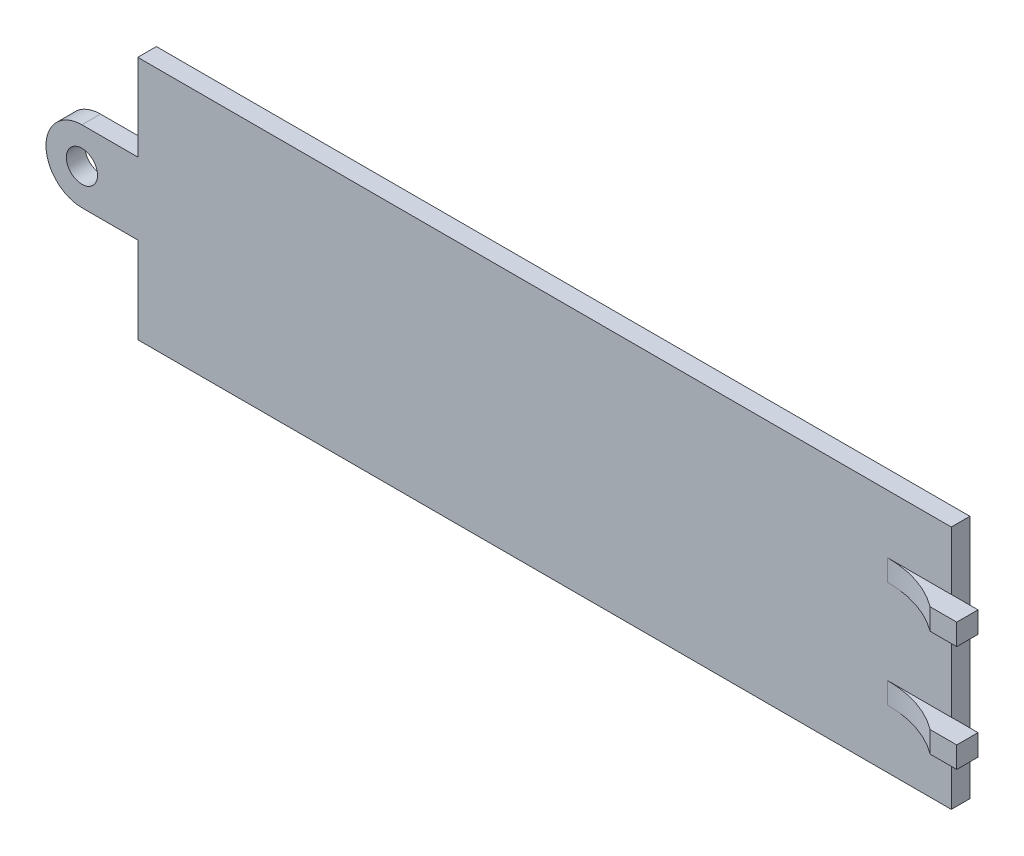
ISO-10303-21;
HEADER;
FILE_DESCRIPTION(('STEP AP214'),'2;1');
FILE_NAME('part.step','',(''),(''),'','','');
FILE_SCHEMA(('AUTOMOTIVE_DESIGN { 1 0 10303 214 1 1 1 1 }'));
ENDSEC;
DATA;
#1=APPLICATION_CONTEXT('core data for automotive mechanical design processes');
#2=APPLICATION_PROTOCOL_DEFINITION('international standard','automotive_design',2000,#1);
#3=PRODUCT_CONTEXT('',#1,'mechanical');
#4=PRODUCT('Part','Part','',(#3));
#5=PRODUCT_RELATED_PRODUCT_CATEGORY('part','',(#4));
#6=PRODUCT_DEFINITION_FORMATION('','',#4);
#7=PRODUCT_DEFINITION_CONTEXT('part definition',#1,'design');
#8=PRODUCT_DEFINITION('design','',#6,#7);
#9=PRODUCT_DEFINITION_SHAPE('','',#8);
#10=(LENGTH_UNIT() NAMED_UNIT(*) SI_UNIT(.MILLI.,.METRE.));
#11=(NAMED_UNIT(*) PLANE_ANGLE_UNIT() SI_UNIT($,.RADIAN.));
#12=(NAMED_UNIT(*) SI_UNIT($,.STERADIAN.) SOLID_ANGLE_UNIT());
#13=UNCERTAINTY_MEASURE_WITH_UNIT(LENGTH_MEASURE(1.E-05),#10,'distance_accuracy_value','');
#14=(GEOMETRIC_REPRESENTATION_CONTEXT(3) GLOBAL_UNCERTAINTY_ASSIGNED_CONTEXT((#13)) GLOBAL_UNIT_ASSIGNED_CONTEXT((#10,
#11,#12)) REPRESENTATION_CONTEXT('',''));
#15=CARTESIAN_POINT('',(0.,0.,0.));
#16=DIRECTION('',(0.,0.,1.));
#17=DIRECTION('',(1.,0.,0.));
#18=AXIS2_PLACEMENT_3D('',#15,#16,#17);
#19=CARTESIAN_POINT('',(38.25,-11.5,1.75));
#20=DIRECTION('',(-1.,0.,0.));
#21=DIRECTION('',(0.,0.,1.));
#22=AXIS2_PLACEMENT_3D('',#19,#20,#21);
#23=PLANE('',#22);
#24=DIRECTION('',(0.,0.,-1.));
#25=VECTOR('',#24,1.);
#26=CARTESIAN_POINT('',(38.25,-6.,3.74));
#27=LINE('',#26,#25);
#28=CARTESIAN_POINT('',(38.25,-6.,1.75));
#29=VERTEX_POINT('',#28);
#30=CARTESIAN_POINT('',(38.25,-6.,1.74));
#31=VERTEX_POINT('',#30);
#32=EDGE_CURVE('E243',#29,#31,#27,.T.);
#33=ORIENTED_EDGE('',*,*,#32,.F.);
#34=DIRECTION('',(0.,1.,0.));
#35=VECTOR('',#34,1.);
#36=CARTESIAN_POINT('',(38.25,-11.5,1.75));
#37=LINE('',#36,#35);
#38=CARTESIAN_POINT('',(38.25,-11.5,1.75));
#39=VERTEX_POINT('',#38);
#40=EDGE_CURVE('E296',#39,#29,#37,.T.);
#41=ORIENTED_EDGE('',*,*,#40,.F.);
#42=DIRECTION('',(0.,0.,-1.));
#43=VECTOR('',#42,1.);
#44=CARTESIAN_POINT('',(38.25,-11.5,1.75));
#45=LINE('',#44,#43);
#46=CARTESIAN_POINT('',(38.25,-11.5,0.));
#47=VERTEX_POINT('',#46);
#48=EDGE_CURVE('E327',#39,#47,#45,.T.);
#49=ORIENTED_EDGE('',*,*,#48,.T.);
#50=DIRECTION('',(0.,1.,0.));
#51=VECTOR('',#50,1.);
#52=CARTESIAN_POINT('',(38.25,-11.5,0.));
#53=LINE('',#52,#51);
#54=CARTESIAN_POINT('',(38.25,11.5,0.));
#55=VERTEX_POINT('',#54);
#56=EDGE_CURVE('E277',#47,#55,#53,.T.);
#57=ORIENTED_EDGE('',*,*,#56,.T.);
#58=DIRECTION('',(0.,0.,-1.));
#59=VECTOR('',#58,1.);
#60=CARTESIAN_POINT('',(38.25,11.5,1.75));
#61=LINE('',#60,#59);
#62=CARTESIAN_POINT('',(38.25,11.5,1.75));
#63=VERTEX_POINT('',#62);
#64=EDGE_CURVE('E299',#63,#55,#61,.T.);
#65=ORIENTED_EDGE('',*,*,#64,.F.);
#66=CARTESIAN_POINT('',(38.25,6.,1.75));
#67=VERTEX_POINT('',#66);
#68=EDGE_CURVE('E295',#67,#63,#37,.T.);
#69=ORIENTED_EDGE('',*,*,#68,.F.);
#70=DIRECTION('',(0.,0.,1.));
#71=VECTOR('',#70,1.);
#72=CARTESIAN_POINT('',(38.25,6.,3.74));
#73=LINE('',#72,#71);
#74=CARTESIAN_POINT('',(38.25,6.,1.74));
#75=VERTEX_POINT('',#74);
#76=EDGE_CURVE('E248',#75,#67,#73,.T.);
#77=ORIENTED_EDGE('',*,*,#76,.F.);
#78=DIRECTION('',(0.,1.,0.));
#79=VECTOR('',#78,1.);
#80=CARTESIAN_POINT('',(38.25,4.,1.74));
#81=LINE('',#80,#79);
#82=CARTESIAN_POINT('',(38.25,4.,1.74));
#83=VERTEX_POINT('',#82);
#84=EDGE_CURVE('E253',#83,#75,#81,.T.);
#85=ORIENTED_EDGE('',*,*,#84,.F.);
#86=DIRECTION('',(0.,0.,-1.));
#87=VECTOR('',#86,1.);
#88=CARTESIAN_POINT('',(38.25,4.,3.74));
#89=LINE('',#88,#87);
#90=CARTESIAN_POINT('',(38.25,4.,1.75));
#91=VERTEX_POINT('',#90);
#92=EDGE_CURVE('E240',#91,#83,#89,.T.);
#93=ORIENTED_EDGE('',*,*,#92,.F.);
#94=CARTESIAN_POINT('',(38.25,-4.,1.75));
#95=VERTEX_POINT('',#94);
#96=EDGE_CURVE('E300',#95,#91,#37,.T.);
#97=ORIENTED_EDGE('',*,*,#96,.F.);
#98=DIRECTION('',(0.,0.,1.));
#99=VECTOR('',#98,1.);
#100=CARTESIAN_POINT('',(38.25,-4.,3.74));
#101=LINE('',#100,#99);
#102=CARTESIAN_POINT('',(38.25,-4.,1.74));
#103=VERTEX_POINT('',#102);
#104=EDGE_CURVE('E432',#103,#95,#101,.T.);
#105=ORIENTED_EDGE('',*,*,#104,.F.);
#106=DIRECTION('',(0.,1.,0.));
#107=VECTOR('',#106,1.);
#108=CARTESIAN_POINT('',(38.25,-6.,1.74));
#109=LINE('',#108,#107);
#110=EDGE_CURVE('E210',#31,#103,#109,.T.);
#111=ORIENTED_EDGE('',*,*,#110,.F.);
#112=EDGE_LOOP('',(#33,#41,#49,#57,#65,#69,#77,#85,#93,#97,#105,#111));
#113=FACE_BOUND('',#112,.T.);
#114=ADVANCED_FACE('F45',(#113),#23,.F.);
#115=CARTESIAN_POINT('',(-43.5,0.,1.75));
#116=DIRECTION('',(0.,0.,-1.));
#117=DIRECTION('',(-1.,0.,0.));
#118=AXIS2_PLACEMENT_3D('',#115,#116,#117);
#119=PLANE('',#118);
#120=DIRECTION('',(0.,-1.,0.));
#121=VECTOR('',#120,1.);
#122=CARTESIAN_POINT('',(32.2633565330813,0.,1.75));
#123=LINE('',#122,#121);
#124=CARTESIAN_POINT('',(32.2633565330813,-6.,1.75));
#125=VERTEX_POINT('',#124);
#126=CARTESIAN_POINT('',(32.2633565330813,-4.,1.75));
#127=VERTEX_POINT('',#126);
#128=EDGE_CURVE('E365',#125,#127,#123,.F.);
#129=ORIENTED_EDGE('',*,*,#128,.T.);
#130=DIRECTION('',(1.,0.,0.));
#131=VECTOR('',#130,1.);
#132=CARTESIAN_POINT('',(40.75,-4.,1.75));
#133=LINE('',#132,#131);
#134=EDGE_CURVE('E369',#127,#95,#133,.T.);
#135=ORIENTED_EDGE('',*,*,#134,.T.);
#136=ORIENTED_EDGE('',*,*,#96,.T.);
#137=DIRECTION('',(-1.,0.,0.));
#138=VECTOR('',#137,1.);
#139=CARTESIAN_POINT('',(40.75,4.,1.75));
#140=LINE('',#139,#138);
#141=CARTESIAN_POINT('',(32.2633565330813,4.,1.75));
#142=VERTEX_POINT('',#141);
#143=EDGE_CURVE('E60',#91,#142,#140,.T.);
#144=ORIENTED_EDGE('',*,*,#143,.T.);
#145=DIRECTION('',(0.,-1.,0.));
#146=VECTOR('',#145,1.);
#147=CARTESIAN_POINT('',(32.2633565330813,0.,1.75));
#148=LINE('',#147,#146);
#149=CARTESIAN_POINT('',(32.2633565330813,6.,1.75));
#150=VERTEX_POINT('',#149);
#151=EDGE_CURVE('E356',#142,#150,#148,.F.);
#152=ORIENTED_EDGE('',*,*,#151,.T.);
#153=DIRECTION('',(1.,0.,0.));
#154=VECTOR('',#153,1.);
#155=CARTESIAN_POINT('',(40.75,6.,1.75));
#156=LINE('',#155,#154);
#157=EDGE_CURVE('E360',#150,#67,#156,.T.);
#158=ORIENTED_EDGE('',*,*,#157,.T.);
#159=ORIENTED_EDGE('',*,*,#68,.T.);
#160=DIRECTION('',(-1.,0.,0.));
#161=VECTOR('',#160,1.);
#162=CARTESIAN_POINT('',(-38.25,11.5,1.75));
#163=LINE('',#162,#161);
#164=CARTESIAN_POINT('',(-38.25,11.5,1.75));
#165=VERTEX_POINT('',#164);
#166=EDGE_CURVE('E272',#63,#165,#163,.T.);
#167=ORIENTED_EDGE('',*,*,#166,.T.);
#168=DIRECTION('',(0.,-1.,0.));
#169=VECTOR('',#168,1.);
#170=CARTESIAN_POINT('',(-38.25,3.37855763611054,1.75));
#171=LINE('',#170,#169);
#172=CARTESIAN_POINT('',(-38.25,3.37855763611054,1.75));
#173=VERTEX_POINT('',#172);
#174=EDGE_CURVE('E276',#165,#173,#171,.T.);
#175=ORIENTED_EDGE('',*,*,#174,.T.);
#176=DIRECTION('',(-1.,0.,0.));
#177=VECTOR('',#176,1.);
#178=CARTESIAN_POINT('',(-43.5,3.37855763611054,1.75));
#179=LINE('',#178,#177);
#180=CARTESIAN_POINT('',(-43.5,3.37855763611055,1.75));
#181=VERTEX_POINT('',#180);
#182=EDGE_CURVE('E280',#173,#181,#179,.T.);
#183=ORIENTED_EDGE('',*,*,#182,.T.);
#184=CARTESIAN_POINT('',(-43.5,0.,1.75));
#185=DIRECTION('',(0.,0.,1.));
#186=DIRECTION('',(-1.,0.,0.));
#187=AXIS2_PLACEMENT_3D('',#184,#185,#186);
#188=CIRCLE('',#187,3.37855763611055);
#189=CARTESIAN_POINT('',(-43.5,-3.37855763611056,1.75));
#190=VERTEX_POINT('',#189);
#191=EDGE_CURVE('E283',#181,#190,#188,.T.);
#192=ORIENTED_EDGE('',*,*,#191,.T.);
#193=DIRECTION('',(1.,0.,0.));
#194=VECTOR('',#193,1.);
#195=CARTESIAN_POINT('',(-43.5,-3.37855763611056,1.75));
#196=LINE('',#195,#194);
#197=CARTESIAN_POINT('',(-38.25,-3.37855763611056,1.75));
#198=VERTEX_POINT('',#197);
#199=EDGE_CURVE('E286',#190,#198,#196,.T.);
#200=ORIENTED_EDGE('',*,*,#199,.T.);
#201=DIRECTION('',(0.,-1.,0.));
#202=VECTOR('',#201,1.);
#203=CARTESIAN_POINT('',(-38.25,-11.5,1.75));
#204=LINE('',#203,#202);
#205=CARTESIAN_POINT('',(-38.25,-11.5,1.75));
#206=VERTEX_POINT('',#205);
#207=EDGE_CURVE('E289',#198,#206,#204,.T.);
#208=ORIENTED_EDGE('',*,*,#207,.T.);
#209=DIRECTION('',(1.,0.,0.));
#210=VECTOR('',#209,1.);
#211=CARTESIAN_POINT('',(-38.25,-11.5,1.75));
#212=LINE('',#211,#210);
#213=EDGE_CURVE('E292',#206,#39,#212,.T.);
#214=ORIENTED_EDGE('',*,*,#213,.T.);
#215=ORIENTED_EDGE('',*,*,#40,.T.);
#216=DIRECTION('',(-1.,0.,0.));
#217=VECTOR('',#216,1.);
#218=CARTESIAN_POINT('',(40.75,-6.,1.75));
#219=LINE('',#218,#217);
#220=EDGE_CURVE('E68',#29,#125,#219,.T.);
#221=ORIENTED_EDGE('',*,*,#220,.T.);
#222=EDGE_LOOP('',(#129,#135,#136,#144,#152,#158,#159,#167,#175,#183,#192,#200,#208,#214,#215,#221));
#223=FACE_BOUND('',#222,.T.);
#224=CARTESIAN_POINT('',(-43.5,0.,1.75));
#225=DIRECTION('',(0.,0.,1.));
#226=DIRECTION('',(1.,0.,0.));
#227=AXIS2_PLACEMENT_3D('',#224,#225,#226);
#228=CIRCLE('',#227,1.46575498801064);
#229=CARTESIAN_POINT('',(-42.0342450119893,0.,1.75));
#230=VERTEX_POINT('',#229);
#231=EDGE_CURVE('E217',#230,#230,#228,.T.);
#232=ORIENTED_EDGE('',*,*,#231,.F.);
#233=EDGE_LOOP('',(#232));
#234=FACE_BOUND('',#233,.T.);
#235=ADVANCED_FACE('F393',(#223,#234),#119,.F.);
#236=CARTESIAN_POINT('',(-43.5,0.,0.));
#237=DIRECTION('',(0.,0.,-1.));
#238=DIRECTION('',(-1.,0.,0.));
#239=AXIS2_PLACEMENT_3D('',#236,#237,#238);
#240=PLANE('',#239);
#241=DIRECTION('',(-1.,0.,0.));
#242=VECTOR('',#241,1.);
#243=CARTESIAN_POINT('',(-38.25,11.5,0.));
#244=LINE('',#243,#242);
#245=CARTESIAN_POINT('',(-38.25,11.5,0.));
#246=VERTEX_POINT('',#245);
#247=EDGE_CURVE('E270',#55,#246,#244,.T.);
#248=ORIENTED_EDGE('',*,*,#247,.F.);
#249=ORIENTED_EDGE('',*,*,#56,.F.);
#250=DIRECTION('',(1.,0.,0.));
#251=VECTOR('',#250,1.);
#252=CARTESIAN_POINT('',(-38.25,-11.5,0.));
#253=LINE('',#252,#251);
#254=CARTESIAN_POINT('',(-38.25,-11.5,0.));
#255=VERTEX_POINT('',#254);
#256=EDGE_CURVE('E319',#255,#47,#253,.T.);
#257=ORIENTED_EDGE('',*,*,#256,.F.);
#258=DIRECTION('',(0.,-1.,0.));
#259=VECTOR('',#258,1.);
#260=CARTESIAN_POINT('',(-38.25,-11.5,0.));
#261=LINE('',#260,#259);
#262=CARTESIAN_POINT('',(-38.25,-3.37855763611056,0.));
#263=VERTEX_POINT('',#262);
#264=EDGE_CURVE('E316',#263,#255,#261,.T.);
#265=ORIENTED_EDGE('',*,*,#264,.F.);
#266=DIRECTION('',(1.,0.,0.));
#267=VECTOR('',#266,1.);
#268=CARTESIAN_POINT('',(-43.5,-3.37855763611056,0.));
#269=LINE('',#268,#267);
#270=CARTESIAN_POINT('',(-43.5,-3.37855763611056,0.));
#271=VERTEX_POINT('',#270);
#272=EDGE_CURVE('E313',#271,#263,#269,.T.);
#273=ORIENTED_EDGE('',*,*,#272,.F.);
#274=CARTESIAN_POINT('',(-43.5,0.,0.));
#275=DIRECTION('',(0.,0.,1.));
#276=DIRECTION('',(-1.,0.,0.));
#277=AXIS2_PLACEMENT_3D('',#274,#275,#276);
#278=CIRCLE('',#277,3.37855763611055);
#279=CARTESIAN_POINT('',(-43.5,3.37855763611055,0.));
#280=VERTEX_POINT('',#279);
#281=EDGE_CURVE('E310',#280,#271,#278,.T.);
#282=ORIENTED_EDGE('',*,*,#281,.F.);
#283=DIRECTION('',(-1.,0.,0.));
#284=VECTOR('',#283,1.);
#285=CARTESIAN_POINT('',(-43.5,3.37855763611054,0.));
#286=LINE('',#285,#284);
#287=CARTESIAN_POINT('',(-38.25,3.37855763611054,0.));
#288=VERTEX_POINT('',#287);
#289=EDGE_CURVE('E307',#288,#280,#286,.T.);
#290=ORIENTED_EDGE('',*,*,#289,.F.);
#291=DIRECTION('',(0.,-1.,0.));
#292=VECTOR('',#291,1.);
#293=CARTESIAN_POINT('',(-38.25,3.37855763611054,0.));
#294=LINE('',#293,#292);
#295=EDGE_CURVE('E304',#246,#288,#294,.T.);
#296=ORIENTED_EDGE('',*,*,#295,.F.);
#297=EDGE_LOOP('',(#248,#249,#257,#265,#273,#282,#290,#296));
#298=FACE_BOUND('',#297,.T.);
#299=CARTESIAN_POINT('',(-43.5,0.,0.));
#300=DIRECTION('',(0.,0.,1.));
#301=DIRECTION('',(1.,0.,0.));
#302=AXIS2_PLACEMENT_3D('',#299,#300,#301);
#303=CIRCLE('',#302,1.46575498801064);
#304=CARTESIAN_POINT('',(-42.0342450119893,0.,0.));
#305=VERTEX_POINT('',#304);
#306=EDGE_CURVE('E212',#305,#305,#303,.T.);
#307=ORIENTED_EDGE('',*,*,#306,.T.);
#308=EDGE_LOOP('',(#307));
#309=FACE_BOUND('',#308,.T.);
#310=ADVANCED_FACE('F457',(#298,#309),#240,.T.);
#311=CARTESIAN_POINT('',(-38.25,11.5,1.75));
#312=DIRECTION('',(0.,-1.,0.));
#313=DIRECTION('',(0.,0.,-1.));
#314=AXIS2_PLACEMENT_3D('',#311,#312,#313);
#315=PLANE('',#314);
#316=ORIENTED_EDGE('',*,*,#247,.T.);
#317=DIRECTION('',(0.,0.,-1.));
#318=VECTOR('',#317,1.);
#319=CARTESIAN_POINT('',(-38.25,11.5,1.75));
#320=LINE('',#319,#318);
#321=EDGE_CURVE('E244',#165,#246,#320,.T.);
#322=ORIENTED_EDGE('',*,*,#321,.F.);
#323=ORIENTED_EDGE('',*,*,#166,.F.);
#324=ORIENTED_EDGE('',*,*,#64,.T.);
#325=EDGE_LOOP('',(#316,#322,#323,#324));
#326=FACE_BOUND('',#325,.T.);
#327=ADVANCED_FACE('F485',(#326),#315,.F.);
#328=CARTESIAN_POINT('',(-38.25,3.37855763611054,1.75));
#329=DIRECTION('',(1.,0.,0.));
#330=DIRECTION('',(0.,0.,-1.));
#331=AXIS2_PLACEMENT_3D('',#328,#329,#330);
#332=PLANE('',#331);
#333=ORIENTED_EDGE('',*,*,#295,.T.);
#334=DIRECTION('',(0.,0.,-1.));
#335=VECTOR('',#334,1.);
#336=CARTESIAN_POINT('',(-38.25,3.37855763611054,1.75));
#337=LINE('',#336,#335);
#338=EDGE_CURVE('E347',#173,#288,#337,.T.);
#339=ORIENTED_EDGE('',*,*,#338,.F.);
#340=ORIENTED_EDGE('',*,*,#174,.F.);
#341=ORIENTED_EDGE('',*,*,#321,.T.);
#342=EDGE_LOOP('',(#333,#339,#340,#341));
#343=FACE_BOUND('',#342,.T.);
#344=ADVANCED_FACE('F481',(#343),#332,.F.);
#345=CARTESIAN_POINT('',(-43.5,3.37855763611054,1.75));
#346=DIRECTION('',(0.,-1.,0.));
#347=DIRECTION('',(1.,0.,0.));
#348=AXIS2_PLACEMENT_3D('',#345,#346,#347);
#349=PLANE('',#348);
#350=ORIENTED_EDGE('',*,*,#289,.T.);
#351=DIRECTION('',(0.,0.,-1.));
#352=VECTOR('',#351,1.);
#353=CARTESIAN_POINT('',(-43.5,3.37855763611055,1.75));
#354=LINE('',#353,#352);
#355=EDGE_CURVE('E343',#181,#280,#354,.T.);
#356=ORIENTED_EDGE('',*,*,#355,.F.);
#357=ORIENTED_EDGE('',*,*,#182,.F.);
#358=ORIENTED_EDGE('',*,*,#338,.T.);
#359=EDGE_LOOP('',(#350,#356,#357,#358));
#360=FACE_BOUND('',#359,.T.);
#361=ADVANCED_FACE('F477',(#360),#349,.F.);
#362=CARTESIAN_POINT('',(-43.5,0.,1.75));
#363=DIRECTION('',(0.,0.,-1.));
#364=DIRECTION('',(-1.,0.,0.));
#365=AXIS2_PLACEMENT_3D('',#362,#363,#364);
#366=CYLINDRICAL_SURFACE('',#365,3.37855763611055);
#367=ORIENTED_EDGE('',*,*,#281,.T.);
#368=DIRECTION('',(0.,0.,-1.));
#369=VECTOR('',#368,1.);
#370=CARTESIAN_POINT('',(-43.5,-3.37855763611056,1.75));
#371=LINE('',#370,#369);
#372=EDGE_CURVE('E339',#190,#271,#371,.T.);
#373=ORIENTED_EDGE('',*,*,#372,.F.);
#374=ORIENTED_EDGE('',*,*,#191,.F.);
#375=ORIENTED_EDGE('',*,*,#355,.T.);
#376=EDGE_LOOP('',(#367,#373,#374,#375));
#377=FACE_BOUND('',#376,.T.);
#378=ADVANCED_FACE('F473',(#377),#366,.T.);
#379=CARTESIAN_POINT('',(-43.5,-3.37855763611056,1.75));
#380=DIRECTION('',(0.,1.,0.));
#381=DIRECTION('',(-1.,0.,0.));
#382=AXIS2_PLACEMENT_3D('',#379,#380,#381);
#383=PLANE('',#382);
#384=ORIENTED_EDGE('',*,*,#272,.T.);
#385=DIRECTION('',(0.,0.,-1.));
#386=VECTOR('',#385,1.);
#387=CARTESIAN_POINT('',(-38.25,-3.37855763611056,1.75));
#388=LINE('',#387,#386);
#389=EDGE_CURVE('E335',#198,#263,#388,.T.);
#390=ORIENTED_EDGE('',*,*,#389,.F.);
#391=ORIENTED_EDGE('',*,*,#199,.F.);
#392=ORIENTED_EDGE('',*,*,#372,.T.);
#393=EDGE_LOOP('',(#384,#390,#391,#392));
#394=FACE_BOUND('',#393,.T.);
#395=ADVANCED_FACE('F469',(#394),#383,.F.);
#396=CARTESIAN_POINT('',(-38.25,-11.5,1.75));
#397=DIRECTION('',(1.,0.,0.));
#398=DIRECTION('',(0.,0.,-1.));
#399=AXIS2_PLACEMENT_3D('',#396,#397,#398);
#400=PLANE('',#399);
#401=ORIENTED_EDGE('',*,*,#264,.T.);
#402=DIRECTION('',(0.,0.,-1.));
#403=VECTOR('',#402,1.);
#404=CARTESIAN_POINT('',(-38.25,-11.5,1.75));
#405=LINE('',#404,#403);
#406=EDGE_CURVE('E331',#206,#255,#405,.T.);
#407=ORIENTED_EDGE('',*,*,#406,.F.);
#408=ORIENTED_EDGE('',*,*,#207,.F.);
#409=ORIENTED_EDGE('',*,*,#389,.T.);
#410=EDGE_LOOP('',(#401,#407,#408,#409));
#411=FACE_BOUND('',#410,.T.);
#412=ADVANCED_FACE('F465',(#411),#400,.F.);
#413=CARTESIAN_POINT('',(-38.25,-11.5,1.75));
#414=DIRECTION('',(0.,1.,0.));
#415=DIRECTION('',(-1.,0.,0.));
#416=AXIS2_PLACEMENT_3D('',#413,#414,#415);
#417=PLANE('',#416);
#418=ORIENTED_EDGE('',*,*,#256,.T.);
#419=ORIENTED_EDGE('',*,*,#48,.F.);
#420=ORIENTED_EDGE('',*,*,#213,.F.);
#421=ORIENTED_EDGE('',*,*,#406,.T.);
#422=EDGE_LOOP('',(#418,#419,#420,#421));
#423=FACE_BOUND('',#422,.T.);
#424=ADVANCED_FACE('F461',(#423),#417,.F.);
#425=CARTESIAN_POINT('',(-43.5,0.,1.75));
#426=DIRECTION('',(0.,0.,-1.));
#427=DIRECTION('',(-1.,0.,0.));
#428=AXIS2_PLACEMENT_3D('',#425,#426,#427);
#429=CYLINDRICAL_SURFACE('',#428,1.46575498801064);
#430=ORIENTED_EDGE('',*,*,#231,.T.);
#431=EDGE_LOOP('',(#430));
#432=FACE_BOUND('',#431,.T.);
#433=ORIENTED_EDGE('',*,*,#306,.F.);
#434=EDGE_LOOP('',(#433));
#435=FACE_BOUND('',#434,.T.);
#436=ADVANCED_FACE('F464',(#432,#435),#429,.F.);
#437=CARTESIAN_POINT('',(40.75,4.,1.74));
#438=DIRECTION('',(0.,0.,1.));
#439=DIRECTION('',(1.,0.,0.));
#440=AXIS2_PLACEMENT_3D('',#437,#438,#439);
#441=PLANE('',#440);
#442=ORIENTED_EDGE('',*,*,#84,.T.);
#443=DIRECTION('',(-1.,0.,0.));
#444=VECTOR('',#443,1.);
#445=CARTESIAN_POINT('',(40.75,6.,1.74));
#446=LINE('',#445,#444);
#447=CARTESIAN_POINT('',(40.75,6.,1.74));
#448=VERTEX_POINT('',#447);
#449=EDGE_CURVE('E223',#448,#75,#446,.T.);
#450=ORIENTED_EDGE('',*,*,#449,.F.);
#451=DIRECTION('',(0.,1.,0.));
#452=VECTOR('',#451,1.);
#453=CARTESIAN_POINT('',(40.75,4.,1.74));
#454=LINE('',#453,#452);
#455=CARTESIAN_POINT('',(40.75,4.,1.74));
#456=VERTEX_POINT('',#455);
#457=EDGE_CURVE('E249',#456,#448,#454,.T.);
#458=ORIENTED_EDGE('',*,*,#457,.F.);
#459=DIRECTION('',(-1.,0.,0.));
#460=VECTOR('',#459,1.);
#461=CARTESIAN_POINT('',(40.75,4.,1.74));
#462=LINE('',#461,#460);
#463=EDGE_CURVE('E235',#456,#83,#462,.T.);
#464=ORIENTED_EDGE('',*,*,#463,.T.);
#465=EDGE_LOOP('',(#442,#450,#458,#464));
#466=FACE_BOUND('',#465,.T.);
#467=ADVANCED_FACE('F404',(#466),#441,.F.);
#468=CARTESIAN_POINT('',(40.75,6.,3.74));
#469=DIRECTION('',(0.,-1.,0.));
#470=DIRECTION('',(0.,0.,-1.));
#471=AXIS2_PLACEMENT_3D('',#468,#469,#470);
#472=PLANE('',#471);
#473=ORIENTED_EDGE('',*,*,#76,.T.);
#474=ORIENTED_EDGE('',*,*,#157,.F.);
#475=CARTESIAN_POINT('',(32.2633565330813,6.,11.75));
#476=DIRECTION('',(0.,-1.,0.));
#477=DIRECTION('',(0.,0.,-1.));
#478=AXIS2_PLACEMENT_3D('',#475,#476,#477);
#479=CIRCLE('',#478,10.);
#480=CARTESIAN_POINT('',(38.25,6.,3.74));
#481=VERTEX_POINT('',#480);
#482=EDGE_CURVE('E54',#150,#481,#479,.T.);
#483=ORIENTED_EDGE('',*,*,#482,.T.);
#484=DIRECTION('',(-1.,0.,0.));
#485=VECTOR('',#484,1.);
#486=CARTESIAN_POINT('',(40.75,6.,3.74));
#487=LINE('',#486,#485);
#488=CARTESIAN_POINT('',(40.75,6.,3.74));
#489=VERTEX_POINT('',#488);
#490=EDGE_CURVE('E227',#489,#481,#487,.T.);
#491=ORIENTED_EDGE('',*,*,#490,.F.);
#492=DIRECTION('',(0.,0.,1.));
#493=VECTOR('',#492,1.);
#494=CARTESIAN_POINT('',(40.75,6.,3.74));
#495=LINE('',#494,#493);
#496=EDGE_CURVE('E262',#448,#489,#495,.T.);
#497=ORIENTED_EDGE('',*,*,#496,.F.);
#498=ORIENTED_EDGE('',*,*,#449,.T.);
#499=EDGE_LOOP('',(#473,#474,#483,#491,#497,#498));
#500=FACE_BOUND('',#499,.T.);
#501=ADVANCED_FACE('F381',(#500),#472,.F.);
#502=CARTESIAN_POINT('',(40.75,4.,3.74));
#503=DIRECTION('',(0.,0.,-1.));
#504=DIRECTION('',(-1.,0.,0.));
#505=AXIS2_PLACEMENT_3D('',#502,#503,#504);
#506=PLANE('',#505);
#507=DIRECTION('',(0.,-1.,0.));
#508=VECTOR('',#507,1.);
#509=CARTESIAN_POINT('',(38.25,4.,3.74));
#510=LINE('',#509,#508);
#511=CARTESIAN_POINT('',(38.25,4.,3.74));
#512=VERTEX_POINT('',#511);
#513=EDGE_CURVE('E245',#481,#512,#510,.T.);
#514=ORIENTED_EDGE('',*,*,#513,.T.);
#515=DIRECTION('',(-1.,0.,0.));
#516=VECTOR('',#515,1.);
#517=CARTESIAN_POINT('',(40.75,4.,3.74));
#518=LINE('',#517,#516);
#519=CARTESIAN_POINT('',(40.75,4.,3.74));
#520=VERTEX_POINT('',#519);
#521=EDGE_CURVE('E231',#520,#512,#518,.T.);
#522=ORIENTED_EDGE('',*,*,#521,.F.);
#523=DIRECTION('',(0.,-1.,0.));
#524=VECTOR('',#523,1.);
#525=CARTESIAN_POINT('',(40.75,4.,3.74));
#526=LINE('',#525,#524);
#527=EDGE_CURVE('E259',#489,#520,#526,.T.);
#528=ORIENTED_EDGE('',*,*,#527,.F.);
#529=ORIENTED_EDGE('',*,*,#490,.T.);
#530=EDGE_LOOP('',(#514,#522,#528,#529));
#531=FACE_BOUND('',#530,.T.);
#532=ADVANCED_FACE('F387',(#531),#506,.F.);
#533=CARTESIAN_POINT('',(40.75,4.,3.74));
#534=DIRECTION('',(0.,1.,0.));
#535=DIRECTION('',(0.,0.,1.));
#536=AXIS2_PLACEMENT_3D('',#533,#534,#535);
#537=PLANE('',#536);
#538=ORIENTED_EDGE('',*,*,#521,.T.);
#539=CARTESIAN_POINT('',(32.2633565330813,4.,11.75));
#540=DIRECTION('',(0.,1.,0.));
#541=DIRECTION('',(0.,0.,1.));
#542=AXIS2_PLACEMENT_3D('',#539,#540,#541);
#543=CIRCLE('',#542,10.);
#544=EDGE_CURVE('E11',#512,#142,#543,.T.);
#545=ORIENTED_EDGE('',*,*,#544,.T.);
#546=ORIENTED_EDGE('',*,*,#143,.F.);
#547=ORIENTED_EDGE('',*,*,#92,.T.);
#548=ORIENTED_EDGE('',*,*,#463,.F.);
#549=DIRECTION('',(0.,0.,-1.));
#550=VECTOR('',#549,1.);
#551=CARTESIAN_POINT('',(40.75,4.,3.74));
#552=LINE('',#551,#550);
#553=EDGE_CURVE('E239',#520,#456,#552,.T.);
#554=ORIENTED_EDGE('',*,*,#553,.F.);
#555=EDGE_LOOP('',(#538,#545,#546,#547,#548,#554));
#556=FACE_BOUND('',#555,.T.);
#557=ADVANCED_FACE('F390',(#556),#537,.F.);
#558=CARTESIAN_POINT('',(40.75,0.,0.));
#559=DIRECTION('',(-1.,0.,0.));
#560=DIRECTION('',(0.,0.,1.));
#561=AXIS2_PLACEMENT_3D('',#558,#559,#560);
#562=PLANE('',#561);
#563=ORIENTED_EDGE('',*,*,#457,.T.);
#564=ORIENTED_EDGE('',*,*,#496,.T.);
#565=ORIENTED_EDGE('',*,*,#527,.T.);
#566=ORIENTED_EDGE('',*,*,#553,.T.);
#567=EDGE_LOOP('',(#563,#564,#565,#566));
#568=FACE_BOUND('',#567,.T.);
#569=ADVANCED_FACE('F407',(#568),#562,.F.);
#570=CARTESIAN_POINT('',(40.75,-6.,1.74));
#571=DIRECTION('',(0.,0.,1.));
#572=DIRECTION('',(1.,0.,0.));
#573=AXIS2_PLACEMENT_3D('',#570,#571,#572);
#574=PLANE('',#573);
#575=ORIENTED_EDGE('',*,*,#110,.T.);
#576=DIRECTION('',(-1.,0.,0.));
#577=VECTOR('',#576,1.);
#578=CARTESIAN_POINT('',(40.75,-4.,1.74));
#579=LINE('',#578,#577);
#580=CARTESIAN_POINT('',(40.75,-4.,1.74));
#581=VERTEX_POINT('',#580);
#582=EDGE_CURVE('E189',#581,#103,#579,.T.);
#583=ORIENTED_EDGE('',*,*,#582,.F.);
#584=DIRECTION('',(0.,1.,0.));
#585=VECTOR('',#584,1.);
#586=CARTESIAN_POINT('',(40.75,-6.,1.74));
#587=LINE('',#586,#585);
#588=CARTESIAN_POINT('',(40.75,-6.,1.74));
#589=VERTEX_POINT('',#588);
#590=EDGE_CURVE('E197',#589,#581,#587,.T.);
#591=ORIENTED_EDGE('',*,*,#590,.F.);
#592=DIRECTION('',(-1.,0.,0.));
#593=VECTOR('',#592,1.);
#594=CARTESIAN_POINT('',(40.75,-6.,1.74));
#595=LINE('',#594,#593);
#596=EDGE_CURVE('E417',#589,#31,#595,.T.);
#597=ORIENTED_EDGE('',*,*,#596,.T.);
#598=EDGE_LOOP('',(#575,#583,#591,#597));
#599=FACE_BOUND('',#598,.T.);
#600=ADVANCED_FACE('F209',(#599),#574,.F.);
#601=CARTESIAN_POINT('',(40.75,-4.,3.74));
#602=DIRECTION('',(0.,-1.,0.));
#603=DIRECTION('',(0.,0.,-1.));
#604=AXIS2_PLACEMENT_3D('',#601,#602,#603);
#605=PLANE('',#604);
#606=ORIENTED_EDGE('',*,*,#104,.T.);
#607=ORIENTED_EDGE('',*,*,#134,.F.);
#608=CARTESIAN_POINT('',(32.2633565330813,-4.,11.75));
#609=DIRECTION('',(0.,-1.,0.));
#610=DIRECTION('',(0.,0.,-1.));
#611=AXIS2_PLACEMENT_3D('',#608,#609,#610);
#612=CIRCLE('',#611,10.);
#613=CARTESIAN_POINT('',(38.25,-4.,3.74));
#614=VERTEX_POINT('',#613);
#615=EDGE_CURVE('E372',#127,#614,#612,.T.);
#616=ORIENTED_EDGE('',*,*,#615,.T.);
#617=DIRECTION('',(-1.,0.,0.));
#618=VECTOR('',#617,1.);
#619=CARTESIAN_POINT('',(40.75,-4.,3.74));
#620=LINE('',#619,#618);
#621=CARTESIAN_POINT('',(40.75,-4.,3.74));
#622=VERTEX_POINT('',#621);
#623=EDGE_CURVE('E192',#622,#614,#620,.T.);
#624=ORIENTED_EDGE('',*,*,#623,.F.);
#625=DIRECTION('',(0.,0.,1.));
#626=VECTOR('',#625,1.);
#627=CARTESIAN_POINT('',(40.75,-4.,3.74));
#628=LINE('',#627,#626);
#629=EDGE_CURVE('E184',#581,#622,#628,.T.);
#630=ORIENTED_EDGE('',*,*,#629,.F.);
#631=ORIENTED_EDGE('',*,*,#582,.T.);
#632=EDGE_LOOP('',(#606,#607,#616,#624,#630,#631));
#633=FACE_BOUND('',#632,.T.);
#634=ADVANCED_FACE('F187',(#633),#605,.F.);
#635=CARTESIAN_POINT('',(40.75,-6.,3.74));
#636=DIRECTION('',(0.,0.,-1.));
#637=DIRECTION('',(-1.,0.,0.));
#638=AXIS2_PLACEMENT_3D('',#635,#636,#637);
#639=PLANE('',#638);
#640=DIRECTION('',(0.,-1.,0.));
#641=VECTOR('',#640,1.);
#642=CARTESIAN_POINT('',(38.25,-6.,3.74));
#643=LINE('',#642,#641);
#644=CARTESIAN_POINT('',(38.25,-6.,3.74));
#645=VERTEX_POINT('',#644);
#646=EDGE_CURVE('E207',#614,#645,#643,.T.);
#647=ORIENTED_EDGE('',*,*,#646,.T.);
#648=DIRECTION('',(-1.,0.,0.));
#649=VECTOR('',#648,1.);
#650=CARTESIAN_POINT('',(40.75,-6.,3.74));
#651=LINE('',#650,#649);
#652=CARTESIAN_POINT('',(40.75,-6.,3.74));
#653=VERTEX_POINT('',#652);
#654=EDGE_CURVE('E219',#653,#645,#651,.T.);
#655=ORIENTED_EDGE('',*,*,#654,.F.);
#656=DIRECTION('',(0.,-1.,0.));
#657=VECTOR('',#656,1.);
#658=CARTESIAN_POINT('',(40.75,-6.,3.74));
#659=LINE('',#658,#657);
#660=EDGE_CURVE('E196',#622,#653,#659,.T.);
#661=ORIENTED_EDGE('',*,*,#660,.F.);
#662=ORIENTED_EDGE('',*,*,#623,.T.);
#663=EDGE_LOOP('',(#647,#655,#661,#662));
#664=FACE_BOUND('',#663,.T.);
#665=ADVANCED_FACE('F440',(#664),#639,.F.);
#666=CARTESIAN_POINT('',(40.75,-6.,3.74));
#667=DIRECTION('',(0.,1.,0.));
#668=DIRECTION('',(0.,0.,1.));
#669=AXIS2_PLACEMENT_3D('',#666,#667,#668);
#670=PLANE('',#669);
#671=ORIENTED_EDGE('',*,*,#654,.T.);
#672=CARTESIAN_POINT('',(32.2633565330813,-6.,11.75));
#673=DIRECTION('',(0.,1.,0.));
#674=DIRECTION('',(0.,0.,1.));
#675=AXIS2_PLACEMENT_3D('',#672,#673,#674);
#676=CIRCLE('',#675,10.);
#677=EDGE_CURVE('E375',#645,#125,#676,.T.);
#678=ORIENTED_EDGE('',*,*,#677,.T.);
#679=ORIENTED_EDGE('',*,*,#220,.F.);
#680=ORIENTED_EDGE('',*,*,#32,.T.);
#681=ORIENTED_EDGE('',*,*,#596,.F.);
#682=DIRECTION('',(0.,0.,-1.));
#683=VECTOR('',#682,1.);
#684=CARTESIAN_POINT('',(40.75,-6.,3.74));
#685=LINE('',#684,#683);
#686=EDGE_CURVE('E202',#653,#589,#685,.T.);
#687=ORIENTED_EDGE('',*,*,#686,.F.);
#688=EDGE_LOOP('',(#671,#678,#679,#680,#681,#687));
#689=FACE_BOUND('',#688,.T.);
#690=ADVANCED_FACE('F423',(#689),#670,.F.);
#691=CARTESIAN_POINT('',(40.75,0.,0.));
#692=DIRECTION('',(-1.,0.,0.));
#693=DIRECTION('',(0.,0.,1.));
#694=AXIS2_PLACEMENT_3D('',#691,#692,#693);
#695=PLANE('',#694);
#696=ORIENTED_EDGE('',*,*,#590,.T.);
#697=ORIENTED_EDGE('',*,*,#629,.T.);
#698=ORIENTED_EDGE('',*,*,#660,.T.);
#699=ORIENTED_EDGE('',*,*,#686,.T.);
#700=EDGE_LOOP('',(#696,#697,#698,#699));
#701=FACE_BOUND('',#700,.T.);
#702=ADVANCED_FACE('F200',(#701),#695,.F.);
#703=CARTESIAN_POINT('',(32.2633565330813,0.,11.75));
#704=DIRECTION('',(0.,-1.,0.));
#705=DIRECTION('',(0.,0.,-1.));
#706=AXIS2_PLACEMENT_3D('',#703,#704,#705);
#707=CYLINDRICAL_SURFACE('',#706,10.);
#708=ORIENTED_EDGE('',*,*,#677,.F.);
#709=ORIENTED_EDGE('',*,*,#646,.F.);
#710=ORIENTED_EDGE('',*,*,#615,.F.);
#711=ORIENTED_EDGE('',*,*,#128,.F.);
#712=EDGE_LOOP('',(#708,#709,#710,#711));
#713=FACE_BOUND('',#712,.T.);
#714=ADVANCED_FACE('F428',(#713),#707,.F.);
#715=CARTESIAN_POINT('',(32.2633565330813,0.,11.75));
#716=DIRECTION('',(0.,-1.,0.));
#717=DIRECTION('',(0.,0.,-1.));
#718=AXIS2_PLACEMENT_3D('',#715,#716,#717);
#719=CYLINDRICAL_SURFACE('',#718,10.);
#720=ORIENTED_EDGE('',*,*,#544,.F.);
#721=ORIENTED_EDGE('',*,*,#513,.F.);
#722=ORIENTED_EDGE('',*,*,#482,.F.);
#723=ORIENTED_EDGE('',*,*,#151,.F.);
#724=EDGE_LOOP('',(#720,#721,#722,#723));
#725=FACE_BOUND('',#724,.T.);
#726=ADVANCED_FACE('F47',(#725),#719,.F.);
#727=CLOSED_SHELL('',(#114,#235,#310,#327,#344,#361,#378,#395,#412,#424,#436,#467,#501,#532,
#557,#569,#600,#634,#665,#690,#702,#714,#726));
#728=MANIFOLD_SOLID_BREP('B2',#727);
#729=ADVANCED_BREP_SHAPE_REPRESENTATION('',(#18,#728),#14);
#730=SHAPE_DEFINITION_REPRESENTATION(#9,#729);
ENDSEC;
END-ISO-10303-21;
